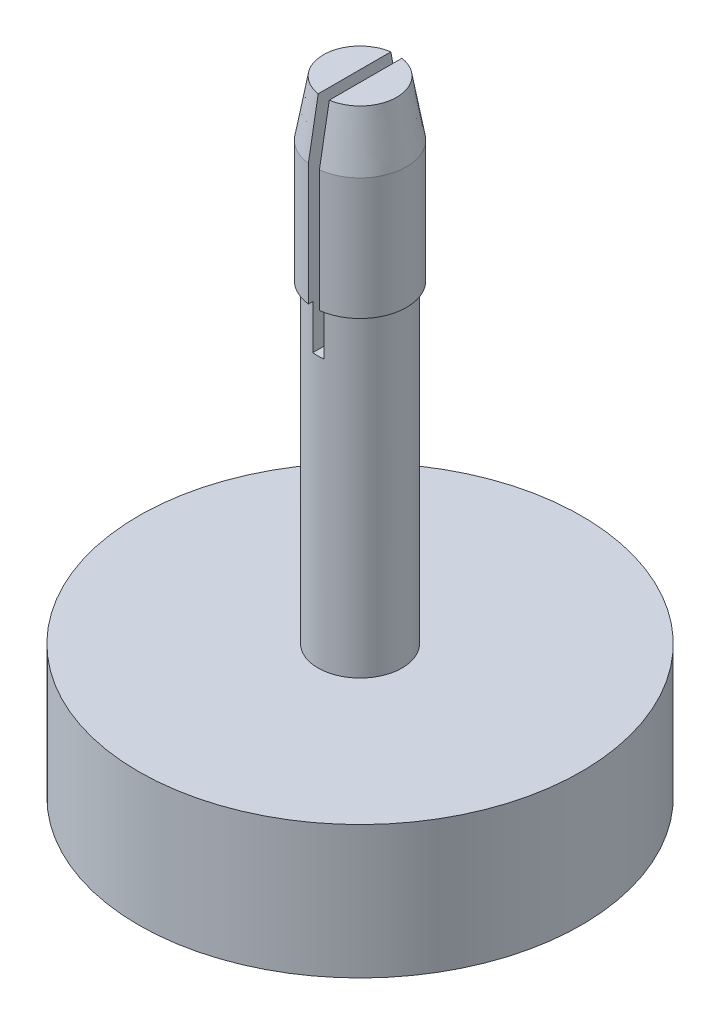
ISO-10303-21;
HEADER;
FILE_DESCRIPTION(('STEP AP214'),'2;1');
FILE_NAME('part.step','',(''),(''),'','','');
FILE_SCHEMA(('AUTOMOTIVE_DESIGN { 1 0 10303 214 1 1 1 1 }'));
ENDSEC;
DATA;
#1=APPLICATION_CONTEXT('core data for automotive mechanical design processes');
#2=APPLICATION_PROTOCOL_DEFINITION('international standard','automotive_design',2000,#1);
#3=PRODUCT_CONTEXT('',#1,'mechanical');
#4=PRODUCT('Part','Part','',(#3));
#5=PRODUCT_RELATED_PRODUCT_CATEGORY('part','',(#4));
#6=PRODUCT_DEFINITION_FORMATION('','',#4);
#7=PRODUCT_DEFINITION_CONTEXT('part definition',#1,'design');
#8=PRODUCT_DEFINITION('design','',#6,#7);
#9=PRODUCT_DEFINITION_SHAPE('','',#8);
#10=(LENGTH_UNIT() NAMED_UNIT(*) SI_UNIT(.MILLI.,.METRE.));
#11=(NAMED_UNIT(*) PLANE_ANGLE_UNIT() SI_UNIT($,.RADIAN.));
#12=(NAMED_UNIT(*) SI_UNIT($,.STERADIAN.) SOLID_ANGLE_UNIT());
#13=UNCERTAINTY_MEASURE_WITH_UNIT(LENGTH_MEASURE(1.E-05),#10,'distance_accuracy_value','');
#14=(GEOMETRIC_REPRESENTATION_CONTEXT(3) GLOBAL_UNCERTAINTY_ASSIGNED_CONTEXT((#13)) GLOBAL_UNIT_ASSIGNED_CONTEXT((#10,
#11,#12)) REPRESENTATION_CONTEXT('',''));
#15=CARTESIAN_POINT('',(0.,0.,0.));
#16=DIRECTION('',(0.,0.,1.));
#17=DIRECTION('',(1.,0.,0.));
#18=AXIS2_PLACEMENT_3D('',#15,#16,#17);
#19=CARTESIAN_POINT('',(0.,14.1,0.));
#20=DIRECTION('',(0.,-1.,0.));
#21=DIRECTION('',(0.,0.,-1.));
#22=AXIS2_PLACEMENT_3D('',#19,#20,#21);
#23=CYLINDRICAL_SURFACE('',#22,1.05);
#24=CARTESIAN_POINT('',(0.,12.85,0.));
#25=DIRECTION('',(0.,1.,0.));
#26=DIRECTION('',(0.,0.,1.));
#27=AXIS2_PLACEMENT_3D('',#24,#25,#26);
#28=CIRCLE('',#27,1.05);
#29=CARTESIAN_POINT('',(-0.125,12.85,1.04253297309965));
#30=VERTEX_POINT('',#29);
#31=CARTESIAN_POINT('',(-0.125,12.85,-1.04253297309965));
#32=VERTEX_POINT('',#31);
#33=EDGE_CURVE('E155',#30,#32,#28,.F.);
#34=ORIENTED_EDGE('',*,*,#33,.T.);
#35=DIRECTION('',(0.,-1.,0.));
#36=VECTOR('',#35,1.);
#37=CARTESIAN_POINT('',(-0.125,14.1,-1.04253297309965));
#38=LINE('',#37,#36);
#39=CARTESIAN_POINT('',(-0.125,10.1,-1.04253297309965));
#40=VERTEX_POINT('',#39);
#41=EDGE_CURVE('E123',#32,#40,#38,.T.);
#42=ORIENTED_EDGE('',*,*,#41,.T.);
#43=CARTESIAN_POINT('',(0.,10.1,0.));
#44=DIRECTION('',(0.,1.,0.));
#45=DIRECTION('',(0.,0.,1.));
#46=AXIS2_PLACEMENT_3D('',#43,#44,#45);
#47=CIRCLE('',#46,1.05);
#48=CARTESIAN_POINT('',(-0.125,10.1,1.04253297309965));
#49=VERTEX_POINT('',#48);
#50=EDGE_CURVE('E249',#40,#49,#47,.T.);
#51=ORIENTED_EDGE('',*,*,#50,.T.);
#52=DIRECTION('',(0.,-1.,0.));
#53=VECTOR('',#52,1.);
#54=CARTESIAN_POINT('',(-0.125,14.1,1.04253297309965));
#55=LINE('',#54,#53);
#56=EDGE_CURVE('E244',#49,#30,#55,.F.);
#57=ORIENTED_EDGE('',*,*,#56,.T.);
#58=EDGE_LOOP('',(#34,#42,#51,#57));
#59=FACE_BOUND('',#58,.T.);
#60=ADVANCED_FACE('F39',(#59),#23,.T.);
#61=CARTESIAN_POINT('',(0.,14.1,0.));
#62=DIRECTION('',(0.,1.,0.));
#63=DIRECTION('',(0.,0.,1.));
#64=AXIS2_PLACEMENT_3D('',#61,#62,#63);
#65=PLANE('',#64);
#66=DIRECTION('',(0.,0.,1.));
#67=VECTOR('',#66,1.);
#68=CARTESIAN_POINT('',(-0.125,14.1,-1.5));
#69=LINE('',#68,#67);
#70=CARTESIAN_POINT('',(-0.125,14.1,-0.820119919333022));
#71=VERTEX_POINT('',#70);
#72=CARTESIAN_POINT('',(-0.125,14.1,0.820119919333022));
#73=VERTEX_POINT('',#72);
#74=EDGE_CURVE('E120',#71,#73,#69,.T.);
#75=ORIENTED_EDGE('',*,*,#74,.F.);
#76=CARTESIAN_POINT('',(0.,14.1,0.));
#77=DIRECTION('',(0.,1.,0.));
#78=DIRECTION('',(0.,0.,1.));
#79=AXIS2_PLACEMENT_3D('',#76,#77,#78);
#80=CIRCLE('',#79,0.82959127411443);
#81=EDGE_CURVE('E135',#71,#73,#80,.T.);
#82=ORIENTED_EDGE('',*,*,#81,.T.);
#83=EDGE_LOOP('',(#75,#82));
#84=FACE_BOUND('',#83,.T.);
#85=ADVANCED_FACE('F134',(#84),#65,.T.);
#86=CARTESIAN_POINT('',(0.,10.1,0.));
#87=DIRECTION('',(0.,1.,0.));
#88=DIRECTION('',(0.,0.,1.));
#89=AXIS2_PLACEMENT_3D('',#86,#87,#88);
#90=PLANE('',#89);
#91=ORIENTED_EDGE('',*,*,#50,.F.);
#92=DIRECTION('',(0.,0.,1.));
#93=VECTOR('',#92,1.);
#94=CARTESIAN_POINT('',(-0.125,10.1,0.));
#95=LINE('',#94,#93);
#96=CARTESIAN_POINT('',(-0.125,10.1,-0.941740410091868));
#97=VERTEX_POINT('',#96);
#98=EDGE_CURVE('E239',#40,#97,#95,.T.);
#99=ORIENTED_EDGE('',*,*,#98,.T.);
#100=CARTESIAN_POINT('',(0.,10.1,0.));
#101=DIRECTION('',(0.,1.,0.));
#102=DIRECTION('',(0.,0.,1.));
#103=AXIS2_PLACEMENT_3D('',#100,#101,#102);
#104=CIRCLE('',#103,0.95);
#105=CARTESIAN_POINT('',(-0.125,10.1,0.941740410091868));
#106=VERTEX_POINT('',#105);
#107=EDGE_CURVE('E254',#97,#106,#104,.T.);
#108=ORIENTED_EDGE('',*,*,#107,.T.);
#109=EDGE_CURVE('E64',#106,#49,#95,.T.);
#110=ORIENTED_EDGE('',*,*,#109,.T.);
#111=EDGE_LOOP('',(#91,#99,#108,#110));
#112=FACE_BOUND('',#111,.T.);
#113=ADVANCED_FACE('F285',(#112),#90,.F.);
#114=CARTESIAN_POINT('',(0.,14.1,0.));
#115=DIRECTION('',(0.,-1.,0.));
#116=DIRECTION('',(0.,0.,-1.));
#117=AXIS2_PLACEMENT_3D('',#114,#115,#116);
#118=CONICAL_SURFACE('',#117,0.82959127411443,0.174532925199429);
#119=CARTESIAN_POINT('',(-0.125,16.54406988197,0.378530725252341));
#120=CARTESIAN_POINT('',(-0.125,16.4327522433879,0.399192830328913));
#121=CARTESIAN_POINT('',(-0.125,16.3214082959029,0.419712228066029));
#122=CARTESIAN_POINT('',(-0.125,16.0986822676715,0.460541771400656));
#123=CARTESIAN_POINT('',(-0.125,15.9873001870087,0.480851917454298));
#124=CARTESIAN_POINT('',(-0.125,15.6531178660345,0.541582833124031));
#125=CARTESIAN_POINT('',(-0.125,15.4302814244016,0.581804102782868));
#126=CARTESIAN_POINT('',(-0.125,14.9845580422132,0.661966043324785));
#127=CARTESIAN_POINT('',(-0.125,14.7616711016275,0.70190671403913));
#128=CARTESIAN_POINT('',(-0.125,14.0929646603573,0.821484275084667));
#129=CARTESIAN_POINT('',(-0.125,13.6471014091609,0.900876377280164));
#130=CARTESIAN_POINT('',(-0.125,12.7353695414358,1.06293655947572));
#131=CARTESIAN_POINT('',(-0.125,12.2694987216099,1.14559221954832));
#132=CARTESIAN_POINT('',(-0.125,11.3377300797799,1.3107303139219));
#133=CARTESIAN_POINT('',(-0.125,10.8718322580117,1.3932127495542));
#134=CARTESIAN_POINT('',(-0.125,10.4059301180301,1.47567072315508));
#135=B_SPLINE_CURVE_WITH_KNOTS('',3,(#119,#120,#121,#122,#123,#124,#125,#126,#127,#128,#129,
#130,#131,#132,#133,#134),.UNSPECIFIED.,.F.,.F.,(4,2,2,2,2,2,2,4),(0.,0.339656618367986,
0.679312496187595,1.35862387864706,2.03793566957135,3.39656494885477,4.81600434101303,
6.23543278389017),.UNSPECIFIED.);
#136=EDGE_CURVE('E129',#73,#30,#135,.T.);
#137=ORIENTED_EDGE('',*,*,#136,.F.);
#138=ORIENTED_EDGE('',*,*,#81,.F.);
#139=CARTESIAN_POINT('',(-0.125,10.4059301180301,-1.47567072315508));
#140=CARTESIAN_POINT('',(-0.125,10.8201070563063,-1.4023694037936));
#141=CARTESIAN_POINT('',(-0.125,11.234280217373,-1.3290465694353));
#142=CARTESIAN_POINT('',(-0.125,12.0626036346339,-1.18227467515865));
#143=CARTESIAN_POINT('',(-0.125,12.4767538908561,-1.10882561539831));
#144=CARTESIAN_POINT('',(-0.125,13.1954316179735,-0.981181368340246));
#145=CARTESIAN_POINT('',(-0.125,13.4999676345109,-0.927034307125581));
#146=CARTESIAN_POINT('',(-0.125,14.109005733286,-0.818550746913015));
#147=CARTESIAN_POINT('',(-0.125,14.413507815548,-0.764214248051825));
#148=CARTESIAN_POINT('',(-0.125,14.8702139621117,-0.682444215382008));
#149=CARTESIAN_POINT('',(-0.125,15.0224417534576,-0.655143280751395));
#150=CARTESIAN_POINT('',(-0.125,15.3268735269412,-0.600409482877412));
#151=CARTESIAN_POINT('',(-0.125,15.4790775090922,-0.572976619707443));
#152=CARTESIAN_POINT('',(-0.125,15.7834514608506,-0.517919826766817));
#153=CARTESIAN_POINT('',(-0.125,15.9356214303588,-0.490295896446693));
#154=CARTESIAN_POINT('',(-0.125,16.239899282752,-0.4347067864715));
#155=CARTESIAN_POINT('',(-0.125,16.3920071655119,-0.406741606132963));
#156=CARTESIAN_POINT('',(-0.125,16.54406988197,-0.378530725252341));
#157=B_SPLINE_CURVE_WITH_KNOTS('',3,(#139,#140,#141,#142,#143,#144,#145,#146,#147,#148,#149,
#150,#151,#152,#153,#154,#155,#156),.UNSPECIFIED.,.F.,.F.,(4,2,2,2,2,2,2,2,4),(0.,
1.26184020439334,2.52367883016234,3.45161566026205,4.37955182084618,4.84352135598502,
5.30749063301688,5.77146124487797,6.23543278614972),.UNSPECIFIED.);
#158=EDGE_CURVE('E116',#32,#71,#157,.T.);
#159=ORIENTED_EDGE('',*,*,#158,.F.);
#160=ORIENTED_EDGE('',*,*,#33,.F.);
#161=EDGE_LOOP('',(#137,#138,#159,#160));
#162=FACE_BOUND('',#161,.T.);
#163=ADVANCED_FACE('F139',(#162),#118,.T.);
#164=CARTESIAN_POINT('',(0.,3.,0.));
#165=DIRECTION('',(0.,-1.,0.));
#166=DIRECTION('',(0.,0.,-1.));
#167=AXIS2_PLACEMENT_3D('',#164,#165,#166);
#168=CYLINDRICAL_SURFACE('',#167,5.);
#169=CARTESIAN_POINT('',(0.,3.,0.));
#170=DIRECTION('',(0.,1.,0.));
#171=DIRECTION('',(0.,0.,1.));
#172=AXIS2_PLACEMENT_3D('',#169,#170,#171);
#173=CIRCLE('',#172,5.);
#174=CARTESIAN_POINT('',(0.,3.,5.));
#175=VERTEX_POINT('',#174);
#176=EDGE_CURVE('E149',#175,#175,#173,.T.);
#177=ORIENTED_EDGE('',*,*,#176,.F.);
#178=EDGE_LOOP('',(#177));
#179=FACE_BOUND('',#178,.T.);
#180=CARTESIAN_POINT('',(0.,0.,0.));
#181=DIRECTION('',(0.,1.,0.));
#182=DIRECTION('',(0.,0.,1.));
#183=AXIS2_PLACEMENT_3D('',#180,#181,#182);
#184=CIRCLE('',#183,5.);
#185=CARTESIAN_POINT('',(0.,0.,5.));
#186=VERTEX_POINT('',#185);
#187=EDGE_CURVE('E153',#186,#186,#184,.T.);
#188=ORIENTED_EDGE('',*,*,#187,.T.);
#189=EDGE_LOOP('',(#188));
#190=FACE_BOUND('',#189,.T.);
#191=ADVANCED_FACE('F265',(#179,#190),#168,.T.);
#192=CARTESIAN_POINT('',(0.,3.,0.));
#193=DIRECTION('',(0.,1.,0.));
#194=DIRECTION('',(0.,0.,1.));
#195=AXIS2_PLACEMENT_3D('',#192,#193,#194);
#196=PLANE('',#195);
#197=CARTESIAN_POINT('',(0.,3.,0.));
#198=DIRECTION('',(0.,1.,0.));
#199=DIRECTION('',(0.,0.,1.));
#200=AXIS2_PLACEMENT_3D('',#197,#198,#199);
#201=CIRCLE('',#200,0.95);
#202=CARTESIAN_POINT('',(0.,3.,0.95));
#203=VERTEX_POINT('',#202);
#204=EDGE_CURVE('E142',#203,#203,#201,.T.);
#205=ORIENTED_EDGE('',*,*,#204,.F.);
#206=EDGE_LOOP('',(#205));
#207=FACE_BOUND('',#206,.T.);
#208=ORIENTED_EDGE('',*,*,#176,.T.);
#209=EDGE_LOOP('',(#208));
#210=FACE_BOUND('',#209,.T.);
#211=ADVANCED_FACE('F269',(#207,#210),#196,.T.);
#212=CARTESIAN_POINT('',(0.,0.,0.));
#213=DIRECTION('',(0.,1.,0.));
#214=DIRECTION('',(0.,0.,1.));
#215=AXIS2_PLACEMENT_3D('',#212,#213,#214);
#216=PLANE('',#215);
#217=ORIENTED_EDGE('',*,*,#187,.F.);
#218=EDGE_LOOP('',(#217));
#219=FACE_BOUND('',#218,.T.);
#220=ADVANCED_FACE('F267',(#219),#216,.F.);
#221=CARTESIAN_POINT('',(0.,10.1,0.));
#222=DIRECTION('',(0.,-1.,0.));
#223=DIRECTION('',(0.,0.,-1.));
#224=AXIS2_PLACEMENT_3D('',#221,#222,#223);
#225=CYLINDRICAL_SURFACE('',#224,0.95);
#226=CARTESIAN_POINT('',(0.,9.1,0.));
#227=DIRECTION('',(0.,-1.,0.));
#228=DIRECTION('',(0.,0.,-1.));
#229=AXIS2_PLACEMENT_3D('',#226,#227,#228);
#230=CIRCLE('',#229,0.95);
#231=CARTESIAN_POINT('',(0.125,9.1,0.941740410091868));
#232=VERTEX_POINT('',#231);
#233=CARTESIAN_POINT('',(-0.125,9.1,0.941740410091868));
#234=VERTEX_POINT('',#233);
#235=EDGE_CURVE('E11',#232,#234,#230,.T.);
#236=ORIENTED_EDGE('',*,*,#235,.T.);
#237=DIRECTION('',(0.,-1.,0.));
#238=VECTOR('',#237,1.);
#239=CARTESIAN_POINT('',(-0.125,10.1,0.941740410091868));
#240=LINE('',#239,#238);
#241=EDGE_CURVE('E212',#234,#106,#240,.F.);
#242=ORIENTED_EDGE('',*,*,#241,.T.);
#243=ORIENTED_EDGE('',*,*,#107,.F.);
#244=DIRECTION('',(0.,-1.,0.));
#245=VECTOR('',#244,1.);
#246=CARTESIAN_POINT('',(-0.125,10.1,-0.941740410091868));
#247=LINE('',#246,#245);
#248=CARTESIAN_POINT('',(-0.125,9.1,-0.941740410091868));
#249=VERTEX_POINT('',#248);
#250=EDGE_CURVE('E204',#97,#249,#247,.T.);
#251=ORIENTED_EDGE('',*,*,#250,.T.);
#252=CARTESIAN_POINT('',(0.125,9.1,-0.941740410091868));
#253=VERTEX_POINT('',#252);
#254=EDGE_CURVE('E44',#249,#253,#230,.T.);
#255=ORIENTED_EDGE('',*,*,#254,.T.);
#256=DIRECTION('',(0.,-1.,0.));
#257=VECTOR('',#256,1.);
#258=CARTESIAN_POINT('',(0.125,10.1,-0.941740410091868));
#259=LINE('',#258,#257);
#260=CARTESIAN_POINT('',(0.125,10.1,-0.941740410091868));
#261=VERTEX_POINT('',#260);
#262=EDGE_CURVE('E201',#253,#261,#259,.F.);
#263=ORIENTED_EDGE('',*,*,#262,.T.);
#264=CARTESIAN_POINT('',(0.125,10.1,0.941740410091868));
#265=VERTEX_POINT('',#264);
#266=EDGE_CURVE('E255',#265,#261,#104,.T.);
#267=ORIENTED_EDGE('',*,*,#266,.F.);
#268=DIRECTION('',(0.,-1.,0.));
#269=VECTOR('',#268,1.);
#270=CARTESIAN_POINT('',(0.125,10.1,0.941740410091868));
#271=LINE('',#270,#269);
#272=EDGE_CURVE('E226',#265,#232,#271,.T.);
#273=ORIENTED_EDGE('',*,*,#272,.T.);
#274=EDGE_LOOP('',(#236,#242,#243,#251,#255,#263,#267,#273));
#275=FACE_BOUND('',#274,.T.);
#276=ORIENTED_EDGE('',*,*,#204,.T.);
#277=EDGE_LOOP('',(#276));
#278=FACE_BOUND('',#277,.T.);
#279=ADVANCED_FACE('F198',(#275,#278),#225,.T.);
#280=CARTESIAN_POINT('',(0.125,12.85,-1.04253297309965));
#281=VERTEX_POINT('',#280);
#282=CARTESIAN_POINT('',(0.125,12.85,1.04253297309965));
#283=VERTEX_POINT('',#282);
#284=EDGE_CURVE('E147',#281,#283,#28,.F.);
#285=ORIENTED_EDGE('',*,*,#284,.T.);
#286=DIRECTION('',(0.,-1.,0.));
#287=VECTOR('',#286,1.);
#288=CARTESIAN_POINT('',(0.125,14.1,1.04253297309965));
#289=LINE('',#288,#287);
#290=CARTESIAN_POINT('',(0.125,10.1,1.04253297309965));
#291=VERTEX_POINT('',#290);
#292=EDGE_CURVE('E56',#283,#291,#289,.T.);
#293=ORIENTED_EDGE('',*,*,#292,.T.);
#294=CARTESIAN_POINT('',(0.125,10.1,-1.04253297309965));
#295=VERTEX_POINT('',#294);
#296=EDGE_CURVE('E250',#291,#295,#47,.T.);
#297=ORIENTED_EDGE('',*,*,#296,.T.);
#298=DIRECTION('',(0.,-1.,0.));
#299=VECTOR('',#298,1.);
#300=CARTESIAN_POINT('',(0.125,14.1,-1.04253297309965));
#301=LINE('',#300,#299);
#302=EDGE_CURVE('E231',#295,#281,#301,.F.);
#303=ORIENTED_EDGE('',*,*,#302,.T.);
#304=EDGE_LOOP('',(#285,#293,#297,#303));
#305=FACE_BOUND('',#304,.T.);
#306=ADVANCED_FACE('F275',(#305),#23,.T.);
#307=DIRECTION('',(0.,0.,-1.));
#308=VECTOR('',#307,1.);
#309=CARTESIAN_POINT('',(0.125,14.1,-1.5));
#310=LINE('',#309,#308);
#311=CARTESIAN_POINT('',(0.125,14.1,0.820119919333022));
#312=VERTEX_POINT('',#311);
#313=CARTESIAN_POINT('',(0.125,14.1,-0.820119919333022));
#314=VERTEX_POINT('',#313);
#315=EDGE_CURVE('E137',#312,#314,#310,.T.);
#316=ORIENTED_EDGE('',*,*,#315,.F.);
#317=EDGE_CURVE('E141',#312,#314,#80,.T.);
#318=ORIENTED_EDGE('',*,*,#317,.T.);
#319=EDGE_LOOP('',(#316,#318));
#320=FACE_BOUND('',#319,.T.);
#321=ADVANCED_FACE('F180',(#320),#65,.T.);
#322=ORIENTED_EDGE('',*,*,#296,.F.);
#323=DIRECTION('',(0.,0.,-1.));
#324=VECTOR('',#323,1.);
#325=CARTESIAN_POINT('',(0.125,10.1,0.));
#326=LINE('',#325,#324);
#327=EDGE_CURVE('E222',#291,#265,#326,.T.);
#328=ORIENTED_EDGE('',*,*,#327,.T.);
#329=ORIENTED_EDGE('',*,*,#266,.T.);
#330=EDGE_CURVE('E227',#261,#295,#326,.T.);
#331=ORIENTED_EDGE('',*,*,#330,.T.);
#332=EDGE_LOOP('',(#322,#328,#329,#331));
#333=FACE_BOUND('',#332,.T.);
#334=ADVANCED_FACE('F291',(#333),#90,.F.);
#335=CARTESIAN_POINT('',(0.125,16.54406988197,-0.378530725252341));
#336=CARTESIAN_POINT('',(0.125,16.4327522433879,-0.399192830328913));
#337=CARTESIAN_POINT('',(0.125,16.3214082959029,-0.419712228066029));
#338=CARTESIAN_POINT('',(0.125,16.0986822676715,-0.460541771400656));
#339=CARTESIAN_POINT('',(0.125,15.9873001870087,-0.480851917454298));
#340=CARTESIAN_POINT('',(0.125,15.6531178660345,-0.541582833124031));
#341=CARTESIAN_POINT('',(0.125,15.4302814244016,-0.581804102782868));
#342=CARTESIAN_POINT('',(0.125,14.9845580422132,-0.661966043324786));
#343=CARTESIAN_POINT('',(0.125,14.7616711016275,-0.701906714039131));
#344=CARTESIAN_POINT('',(0.125,14.0929646603573,-0.821484275084667));
#345=CARTESIAN_POINT('',(0.125,13.6471014091609,-0.900876377280164));
#346=CARTESIAN_POINT('',(0.125,12.7353695414358,-1.06293655947572));
#347=CARTESIAN_POINT('',(0.125,12.2694987216099,-1.14559221954832));
#348=CARTESIAN_POINT('',(0.125,11.3377300797799,-1.3107303139219));
#349=CARTESIAN_POINT('',(0.125,10.8718322580117,-1.3932127495542));
#350=CARTESIAN_POINT('',(0.125,10.4059301180301,-1.47567072315508));
#351=B_SPLINE_CURVE_WITH_KNOTS('',3,(#335,#336,#337,#338,#339,#340,#341,#342,#343,#344,#345,
#346,#347,#348,#349,#350),.UNSPECIFIED.,.F.,.F.,(4,2,2,2,2,2,2,4),(0.,0.339656618367986,
0.679312496187595,1.35862387864706,2.03793566957135,3.39656494885477,4.81600434101302,
6.23543278389017),.UNSPECIFIED.);
#352=EDGE_CURVE('E130',#314,#281,#351,.T.);
#353=ORIENTED_EDGE('',*,*,#352,.F.);
#354=ORIENTED_EDGE('',*,*,#317,.F.);
#355=CARTESIAN_POINT('',(0.125,10.4059301180301,1.47567072315508));
#356=CARTESIAN_POINT('',(0.125,10.8201070563063,1.4023694037936));
#357=CARTESIAN_POINT('',(0.125,11.234280217373,1.3290465694353));
#358=CARTESIAN_POINT('',(0.125,12.0626036346339,1.18227467515865));
#359=CARTESIAN_POINT('',(0.125,12.4767538908561,1.10882561539831));
#360=CARTESIAN_POINT('',(0.125,13.1954316179735,0.981181368340246));
#361=CARTESIAN_POINT('',(0.125,13.4999676345109,0.927034307125581));
#362=CARTESIAN_POINT('',(0.125,14.109005733286,0.818550746913015));
#363=CARTESIAN_POINT('',(0.125,14.413507815548,0.764214248051825));
#364=CARTESIAN_POINT('',(0.125,14.8702139621117,0.682444215382008));
#365=CARTESIAN_POINT('',(0.125,15.0224417534576,0.655143280751395));
#366=CARTESIAN_POINT('',(0.125,15.3268735269412,0.600409482877412));
#367=CARTESIAN_POINT('',(0.125,15.4790775090922,0.572976619707443));
#368=CARTESIAN_POINT('',(0.125,15.7834514608506,0.517919826766817));
#369=CARTESIAN_POINT('',(0.125,15.9356214303588,0.490295896446693));
#370=CARTESIAN_POINT('',(0.125,16.239899282752,0.4347067864715));
#371=CARTESIAN_POINT('',(0.125,16.3920071655119,0.406741606132963));
#372=CARTESIAN_POINT('',(0.125,16.54406988197,0.378530725252341));
#373=B_SPLINE_CURVE_WITH_KNOTS('',3,(#355,#356,#357,#358,#359,#360,#361,#362,#363,#364,#365,
#366,#367,#368,#369,#370,#371,#372),.UNSPECIFIED.,.F.,.F.,(4,2,2,2,2,2,2,2,4),(0.,
1.26184020439334,2.52367883016234,3.45161566026205,4.37955182084618,4.84352135598502,
5.30749063301688,5.77146124487797,6.23543278614972),.UNSPECIFIED.);
#374=EDGE_CURVE('E158',#283,#312,#373,.T.);
#375=ORIENTED_EDGE('',*,*,#374,.F.);
#376=ORIENTED_EDGE('',*,*,#284,.F.);
#377=EDGE_LOOP('',(#353,#354,#375,#376));
#378=FACE_BOUND('',#377,.T.);
#379=ADVANCED_FACE('F41',(#378),#118,.T.);
#380=CARTESIAN_POINT('',(0.,9.1,0.));
#381=DIRECTION('',(0.,-1.,0.));
#382=DIRECTION('',(0.,0.,-1.));
#383=AXIS2_PLACEMENT_3D('',#380,#381,#382);
#384=PLANE('',#383);
#385=DIRECTION('',(0.,0.,-1.));
#386=VECTOR('',#385,1.);
#387=CARTESIAN_POINT('',(0.125,9.1,-1.5));
#388=LINE('',#387,#386);
#389=EDGE_CURVE('E210',#232,#253,#388,.T.);
#390=ORIENTED_EDGE('',*,*,#389,.T.);
#391=ORIENTED_EDGE('',*,*,#254,.F.);
#392=DIRECTION('',(0.,0.,1.));
#393=VECTOR('',#392,1.);
#394=CARTESIAN_POINT('',(-0.125,9.1,-1.5));
#395=LINE('',#394,#393);
#396=EDGE_CURVE('E208',#249,#234,#395,.T.);
#397=ORIENTED_EDGE('',*,*,#396,.T.);
#398=ORIENTED_EDGE('',*,*,#235,.F.);
#399=EDGE_LOOP('',(#390,#391,#397,#398));
#400=FACE_BOUND('',#399,.T.);
#401=ADVANCED_FACE('F175',(#400),#384,.F.);
#402=CARTESIAN_POINT('',(-0.125,9.1,-1.5));
#403=DIRECTION('',(-1.,0.,0.));
#404=DIRECTION('',(0.,0.,1.));
#405=AXIS2_PLACEMENT_3D('',#402,#403,#404);
#406=PLANE('',#405);
#407=ORIENTED_EDGE('',*,*,#396,.F.);
#408=ORIENTED_EDGE('',*,*,#250,.F.);
#409=ORIENTED_EDGE('',*,*,#98,.F.);
#410=ORIENTED_EDGE('',*,*,#41,.F.);
#411=ORIENTED_EDGE('',*,*,#158,.T.);
#412=ORIENTED_EDGE('',*,*,#74,.T.);
#413=ORIENTED_EDGE('',*,*,#136,.T.);
#414=ORIENTED_EDGE('',*,*,#56,.F.);
#415=ORIENTED_EDGE('',*,*,#109,.F.);
#416=ORIENTED_EDGE('',*,*,#241,.F.);
#417=EDGE_LOOP('',(#407,#408,#409,#410,#411,#412,#413,#414,#415,#416));
#418=FACE_BOUND('',#417,.T.);
#419=ADVANCED_FACE('F119',(#418),#406,.F.);
#420=CARTESIAN_POINT('',(0.125,9.1,-1.5));
#421=DIRECTION('',(1.,0.,0.));
#422=DIRECTION('',(0.,0.,-1.));
#423=AXIS2_PLACEMENT_3D('',#420,#421,#422);
#424=PLANE('',#423);
#425=ORIENTED_EDGE('',*,*,#389,.F.);
#426=ORIENTED_EDGE('',*,*,#272,.F.);
#427=ORIENTED_EDGE('',*,*,#327,.F.);
#428=ORIENTED_EDGE('',*,*,#292,.F.);
#429=ORIENTED_EDGE('',*,*,#374,.T.);
#430=ORIENTED_EDGE('',*,*,#315,.T.);
#431=ORIENTED_EDGE('',*,*,#352,.T.);
#432=ORIENTED_EDGE('',*,*,#302,.F.);
#433=ORIENTED_EDGE('',*,*,#330,.F.);
#434=ORIENTED_EDGE('',*,*,#262,.F.);
#435=EDGE_LOOP('',(#425,#426,#427,#428,#429,#430,#431,#432,#433,#434));
#436=FACE_BOUND('',#435,.T.);
#437=ADVANCED_FACE('F170',(#436),#424,.F.);
#438=CLOSED_SHELL('',(#60,#85,#113,#163,#191,#211,#220,#279,#306,#321,#334,#379,#401,#419,#437));
#439=MANIFOLD_SOLID_BREP('B2',#438);
#440=ADVANCED_BREP_SHAPE_REPRESENTATION('',(#18,#439),#14);
#441=SHAPE_DEFINITION_REPRESENTATION(#9,#440);
ENDSEC;
END-ISO-10303-21;
